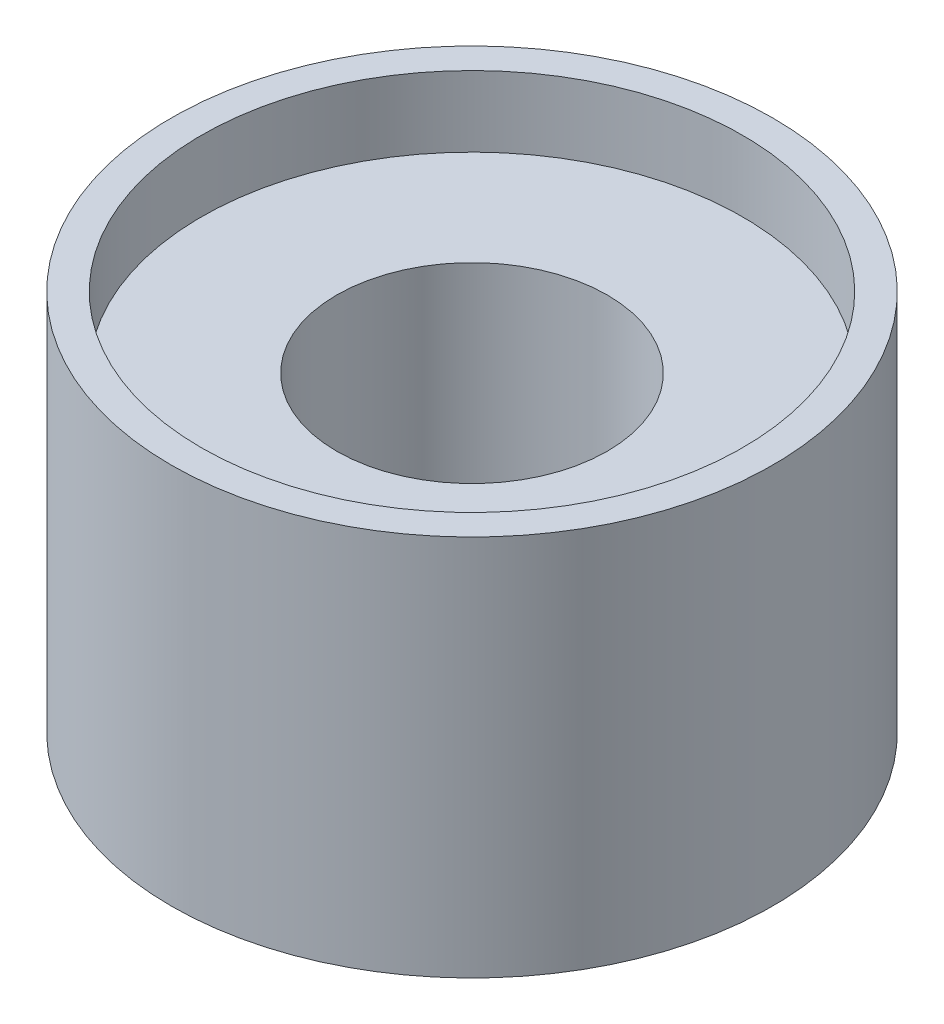
ISO-10303-21;
HEADER;
FILE_DESCRIPTION(('STEP AP214'),'2;1');
FILE_NAME('part.step','',(''),(''),'','','');
FILE_SCHEMA(('AUTOMOTIVE_DESIGN { 1 0 10303 214 1 1 1 1 }'));
ENDSEC;
DATA;
#1=APPLICATION_CONTEXT('core data for automotive mechanical design processes');
#2=APPLICATION_PROTOCOL_DEFINITION('international standard','automotive_design',2000,#1);
#3=PRODUCT_CONTEXT('',#1,'mechanical');
#4=PRODUCT('Part','Part','',(#3));
#5=PRODUCT_RELATED_PRODUCT_CATEGORY('part','',(#4));
#6=PRODUCT_DEFINITION_FORMATION('','',#4);
#7=PRODUCT_DEFINITION_CONTEXT('part definition',#1,'design');
#8=PRODUCT_DEFINITION('design','',#6,#7);
#9=PRODUCT_DEFINITION_SHAPE('','',#8);
#10=(LENGTH_UNIT() NAMED_UNIT(*) SI_UNIT(.MILLI.,.METRE.));
#11=(NAMED_UNIT(*) PLANE_ANGLE_UNIT() SI_UNIT($,.RADIAN.));
#12=(NAMED_UNIT(*) SI_UNIT($,.STERADIAN.) SOLID_ANGLE_UNIT());
#13=UNCERTAINTY_MEASURE_WITH_UNIT(LENGTH_MEASURE(1.E-05),#10,'distance_accuracy_value','');
#14=(GEOMETRIC_REPRESENTATION_CONTEXT(3) GLOBAL_UNCERTAINTY_ASSIGNED_CONTEXT((#13)) GLOBAL_UNIT_ASSIGNED_CONTEXT((#10,
#11,#12)) REPRESENTATION_CONTEXT('',''));
#15=CARTESIAN_POINT('',(0.,0.,0.));
#16=DIRECTION('',(0.,0.,1.));
#17=DIRECTION('',(1.,0.,0.));
#18=AXIS2_PLACEMENT_3D('',#15,#16,#17);
#19=CARTESIAN_POINT('',(0.,63.5,0.));
#20=DIRECTION('',(0.,-1.,0.));
#21=DIRECTION('',(0.,0.,-1.));
#22=AXIS2_PLACEMENT_3D('',#19,#20,#21);
#23=CYLINDRICAL_SURFACE('',#22,90.);
#24=CARTESIAN_POINT('',(0.,-63.5,0.));
#25=DIRECTION('',(0.,1.,0.));
#26=DIRECTION('',(0.,0.,1.));
#27=AXIS2_PLACEMENT_3D('',#24,#25,#26);
#28=CIRCLE('',#27,90.);
#29=CARTESIAN_POINT('',(0.,-63.5,90.));
#30=VERTEX_POINT('',#29);
#31=EDGE_CURVE('E49',#30,#30,#28,.T.);
#32=ORIENTED_EDGE('',*,*,#31,.F.);
#33=EDGE_LOOP('',(#32));
#34=FACE_BOUND('',#33,.T.);
#35=CARTESIAN_POINT('',(0.,-40.,0.));
#36=DIRECTION('',(0.,1.,0.));
#37=DIRECTION('',(0.,0.,1.));
#38=AXIS2_PLACEMENT_3D('',#35,#36,#37);
#39=CIRCLE('',#38,90.);
#40=CARTESIAN_POINT('',(0.,-40.,90.));
#41=VERTEX_POINT('',#40);
#42=EDGE_CURVE('E52',#41,#41,#39,.T.);
#43=ORIENTED_EDGE('',*,*,#42,.T.);
#44=EDGE_LOOP('',(#43));
#45=FACE_BOUND('',#44,.T.);
#46=ADVANCED_FACE('F31',(#34,#45),#23,.F.);
#47=CARTESIAN_POINT('',(0.,63.5,0.));
#48=DIRECTION('',(0.,1.,0.));
#49=DIRECTION('',(0.,0.,1.));
#50=AXIS2_PLACEMENT_3D('',#47,#48,#49);
#51=PLANE('',#50);
#52=CARTESIAN_POINT('',(0.,63.5,0.));
#53=DIRECTION('',(0.,1.,0.));
#54=DIRECTION('',(0.,0.,1.));
#55=AXIS2_PLACEMENT_3D('',#52,#53,#54);
#56=CIRCLE('',#55,100.);
#57=CARTESIAN_POINT('',(0.,63.5,100.));
#58=VERTEX_POINT('',#57);
#59=EDGE_CURVE('E38',#58,#58,#56,.T.);
#60=ORIENTED_EDGE('',*,*,#59,.T.);
#61=EDGE_LOOP('',(#60));
#62=FACE_BOUND('',#61,.T.);
#63=CARTESIAN_POINT('',(0.,63.5,0.));
#64=DIRECTION('',(0.,1.,0.));
#65=DIRECTION('',(0.,0.,1.));
#66=AXIS2_PLACEMENT_3D('',#63,#64,#65);
#67=CIRCLE('',#66,90.);
#68=CARTESIAN_POINT('',(0.,63.5,90.));
#69=VERTEX_POINT('',#68);
#70=EDGE_CURVE('E47',#69,#69,#67,.T.);
#71=ORIENTED_EDGE('',*,*,#70,.F.);
#72=EDGE_LOOP('',(#71));
#73=FACE_BOUND('',#72,.T.);
#74=ADVANCED_FACE('F82',(#62,#73),#51,.T.);
#75=CARTESIAN_POINT('',(0.,-63.5,0.));
#76=DIRECTION('',(0.,1.,0.));
#77=DIRECTION('',(0.,0.,1.));
#78=AXIS2_PLACEMENT_3D('',#75,#76,#77);
#79=PLANE('',#78);
#80=CARTESIAN_POINT('',(0.,-63.5,0.));
#81=DIRECTION('',(0.,1.,0.));
#82=DIRECTION('',(0.,0.,1.));
#83=AXIS2_PLACEMENT_3D('',#80,#81,#82);
#84=CIRCLE('',#83,100.);
#85=CARTESIAN_POINT('',(0.,-63.5,100.));
#86=VERTEX_POINT('',#85);
#87=EDGE_CURVE('E42',#86,#86,#84,.T.);
#88=ORIENTED_EDGE('',*,*,#87,.F.);
#89=EDGE_LOOP('',(#88));
#90=FACE_BOUND('',#89,.T.);
#91=ORIENTED_EDGE('',*,*,#31,.T.);
#92=EDGE_LOOP('',(#91));
#93=FACE_BOUND('',#92,.T.);
#94=ADVANCED_FACE('F87',(#90,#93),#79,.F.);
#95=CARTESIAN_POINT('',(0.,63.5,0.));
#96=DIRECTION('',(0.,-1.,0.));
#97=DIRECTION('',(0.,0.,-1.));
#98=AXIS2_PLACEMENT_3D('',#95,#96,#97);
#99=CYLINDRICAL_SURFACE('',#98,100.);
#100=ORIENTED_EDGE('',*,*,#59,.F.);
#101=EDGE_LOOP('',(#100));
#102=FACE_BOUND('',#101,.T.);
#103=ORIENTED_EDGE('',*,*,#87,.T.);
#104=EDGE_LOOP('',(#103));
#105=FACE_BOUND('',#104,.T.);
#106=ADVANCED_FACE('F33',(#102,#105),#99,.T.);
#107=CARTESIAN_POINT('',(0.,40.,0.));
#108=DIRECTION('',(0.,1.,0.));
#109=DIRECTION('',(0.,0.,1.));
#110=AXIS2_PLACEMENT_3D('',#107,#108,#109);
#111=CIRCLE('',#110,90.);
#112=CARTESIAN_POINT('',(0.,40.,90.));
#113=VERTEX_POINT('',#112);
#114=EDGE_CURVE('E10',#113,#113,#111,.T.);
#115=ORIENTED_EDGE('',*,*,#114,.F.);
#116=EDGE_LOOP('',(#115));
#117=FACE_BOUND('',#116,.T.);
#118=ORIENTED_EDGE('',*,*,#70,.T.);
#119=EDGE_LOOP('',(#118));
#120=FACE_BOUND('',#119,.T.);
#121=ADVANCED_FACE('F70',(#117,#120),#23,.F.);
#122=CARTESIAN_POINT('',(0.,40.,0.));
#123=DIRECTION('',(0.,1.,0.));
#124=DIRECTION('',(0.,0.,1.));
#125=AXIS2_PLACEMENT_3D('',#122,#123,#124);
#126=PLANE('',#125);
#127=ORIENTED_EDGE('',*,*,#114,.T.);
#128=EDGE_LOOP('',(#127));
#129=FACE_BOUND('',#128,.T.);
#130=CARTESIAN_POINT('',(0.,40.,0.));
#131=DIRECTION('',(0.,1.,0.));
#132=DIRECTION('',(0.,0.,1.));
#133=AXIS2_PLACEMENT_3D('',#130,#131,#132);
#134=CIRCLE('',#133,45.);
#135=CARTESIAN_POINT('',(0.,40.,45.));
#136=VERTEX_POINT('',#135);
#137=EDGE_CURVE('E57',#136,#136,#134,.T.);
#138=ORIENTED_EDGE('',*,*,#137,.F.);
#139=EDGE_LOOP('',(#138));
#140=FACE_BOUND('',#139,.T.);
#141=ADVANCED_FACE('F67',(#129,#140),#126,.T.);
#142=CARTESIAN_POINT('',(0.,-40.,0.));
#143=DIRECTION('',(0.,1.,0.));
#144=DIRECTION('',(0.,0.,1.));
#145=AXIS2_PLACEMENT_3D('',#142,#143,#144);
#146=PLANE('',#145);
#147=ORIENTED_EDGE('',*,*,#42,.F.);
#148=EDGE_LOOP('',(#147));
#149=FACE_BOUND('',#148,.T.);
#150=CARTESIAN_POINT('',(0.,-40.,0.));
#151=DIRECTION('',(0.,1.,0.));
#152=DIRECTION('',(0.,0.,1.));
#153=AXIS2_PLACEMENT_3D('',#150,#151,#152);
#154=CIRCLE('',#153,45.);
#155=CARTESIAN_POINT('',(0.,-40.,45.));
#156=VERTEX_POINT('',#155);
#157=EDGE_CURVE('E58',#156,#156,#154,.T.);
#158=ORIENTED_EDGE('',*,*,#157,.T.);
#159=EDGE_LOOP('',(#158));
#160=FACE_BOUND('',#159,.T.);
#161=ADVANCED_FACE('F69',(#149,#160),#146,.F.);
#162=CARTESIAN_POINT('',(0.,40.,0.));
#163=DIRECTION('',(0.,-1.,0.));
#164=DIRECTION('',(0.,0.,-1.));
#165=AXIS2_PLACEMENT_3D('',#162,#163,#164);
#166=CYLINDRICAL_SURFACE('',#165,45.);
#167=ORIENTED_EDGE('',*,*,#137,.T.);
#168=EDGE_LOOP('',(#167));
#169=FACE_BOUND('',#168,.T.);
#170=ORIENTED_EDGE('',*,*,#157,.F.);
#171=EDGE_LOOP('',(#170));
#172=FACE_BOUND('',#171,.T.);
#173=ADVANCED_FACE('F64',(#169,#172),#166,.F.);
#174=CLOSED_SHELL('',(#46,#74,#94,#106,#121,#141,#161,#173));
#175=MANIFOLD_SOLID_BREP('B2',#174);
#176=ADVANCED_BREP_SHAPE_REPRESENTATION('',(#18,#175),#14);
#177=SHAPE_DEFINITION_REPRESENTATION(#9,#176);
ENDSEC;
END-ISO-10303-21;
